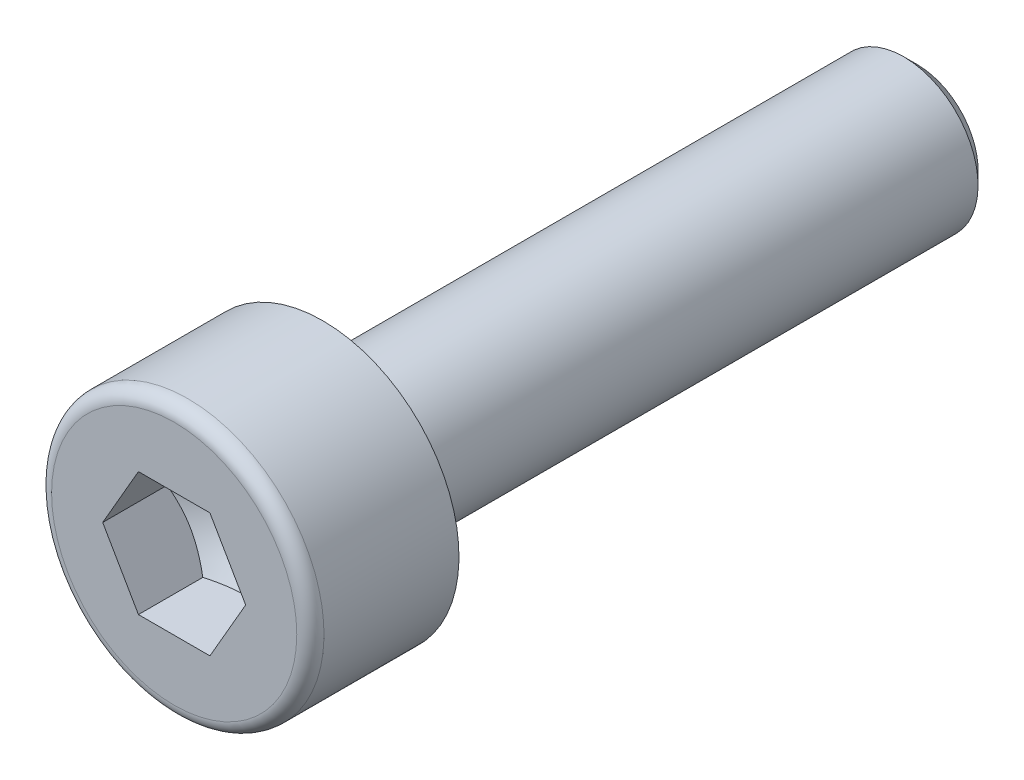
ISO-10303-21;
HEADER;
FILE_DESCRIPTION(('STEP AP214'),'2;1');
FILE_NAME('part.step','',(''),(''),'','','');
FILE_SCHEMA(('AUTOMOTIVE_DESIGN { 1 0 10303 214 1 1 1 1 }'));
ENDSEC;
DATA;
#1=APPLICATION_CONTEXT('core data for automotive mechanical design processes');
#2=APPLICATION_PROTOCOL_DEFINITION('international standard','automotive_design',2000,#1);
#3=PRODUCT_CONTEXT('',#1,'mechanical');
#4=PRODUCT('Part','Part','',(#3));
#5=PRODUCT_RELATED_PRODUCT_CATEGORY('part','',(#4));
#6=PRODUCT_DEFINITION_FORMATION('','',#4);
#7=PRODUCT_DEFINITION_CONTEXT('part definition',#1,'design');
#8=PRODUCT_DEFINITION('design','',#6,#7);
#9=PRODUCT_DEFINITION_SHAPE('','',#8);
#10=(LENGTH_UNIT() NAMED_UNIT(*) SI_UNIT(.MILLI.,.METRE.));
#11=(NAMED_UNIT(*) PLANE_ANGLE_UNIT() SI_UNIT($,.RADIAN.));
#12=(NAMED_UNIT(*) SI_UNIT($,.STERADIAN.) SOLID_ANGLE_UNIT());
#13=UNCERTAINTY_MEASURE_WITH_UNIT(LENGTH_MEASURE(1.E-05),#10,'distance_accuracy_value','');
#14=(GEOMETRIC_REPRESENTATION_CONTEXT(3) GLOBAL_UNCERTAINTY_ASSIGNED_CONTEXT((#13)) GLOBAL_UNIT_ASSIGNED_CONTEXT((#10,
#11,#12)) REPRESENTATION_CONTEXT('',''));
#15=CARTESIAN_POINT('',(0.,0.,0.));
#16=DIRECTION('',(0.,0.,1.));
#17=DIRECTION('',(1.,0.,0.));
#18=AXIS2_PLACEMENT_3D('',#15,#16,#17);
#19=CARTESIAN_POINT('',(0.,1.375,0.));
#20=DIRECTION('',(0.,0.,-1.));
#21=DIRECTION('',(0.,1.,0.));
#22=AXIS2_PLACEMENT_3D('',#19,#20,#21);
#23=PLANE('',#22);
#24=CARTESIAN_POINT('',(0.,0.,0.));
#25=DIRECTION('',(0.,0.,-1.));
#26=DIRECTION('',(0.,1.,0.));
#27=AXIS2_PLACEMENT_3D('',#24,#25,#26);
#28=CIRCLE('',#27,2.75);
#29=CARTESIAN_POINT('',(0.,2.75,0.));
#30=VERTEX_POINT('',#29);
#31=EDGE_CURVE('E11',#30,#30,#28,.T.);
#32=ORIENTED_EDGE('',*,*,#31,.T.);
#33=EDGE_LOOP('',(#32));
#34=FACE_BOUND('',#33,.T.);
#35=CARTESIAN_POINT('',(0.,0.,0.));
#36=DIRECTION('',(0.,0.,1.));
#37=DIRECTION('',(0.,1.,0.));
#38=AXIS2_PLACEMENT_3D('',#35,#36,#37);
#39=CIRCLE('',#38,1.5);
#40=CARTESIAN_POINT('',(0.,-1.5,0.));
#41=VERTEX_POINT('',#40);
#42=EDGE_CURVE('E164',#41,#41,#39,.T.);
#43=ORIENTED_EDGE('',*,*,#42,.T.);
#44=EDGE_LOOP('',(#43));
#45=FACE_BOUND('',#44,.T.);
#46=ADVANCED_FACE('F16',(#34,#45),#23,.T.);
#47=CARTESIAN_POINT('',(0.,0.,1.3625));
#48=DIRECTION('',(0.,0.,1.));
#49=DIRECTION('',(0.,1.,0.));
#50=AXIS2_PLACEMENT_3D('',#47,#48,#49);
#51=CYLINDRICAL_SURFACE('',#50,2.75);
#52=CARTESIAN_POINT('',(0.,0.,2.725));
#53=DIRECTION('',(0.,0.,-1.));
#54=DIRECTION('',(0.,1.,0.));
#55=AXIS2_PLACEMENT_3D('',#52,#53,#54);
#56=CIRCLE('',#55,2.75);
#57=CARTESIAN_POINT('',(0.,2.75,2.725));
#58=VERTEX_POINT('',#57);
#59=EDGE_CURVE('E25',#58,#58,#56,.T.);
#60=ORIENTED_EDGE('',*,*,#59,.T.);
#61=EDGE_LOOP('',(#60));
#62=FACE_BOUND('',#61,.T.);
#63=ORIENTED_EDGE('',*,*,#31,.F.);
#64=EDGE_LOOP('',(#63));
#65=FACE_BOUND('',#64,.T.);
#66=ADVANCED_FACE('F206',(#62,#65),#51,.T.);
#67=CARTESIAN_POINT('',(0.,0.,2.725));
#68=DIRECTION('',(0.,0.,-1.));
#69=DIRECTION('',(-1.,0.,0.));
#70=AXIS2_PLACEMENT_3D('',#67,#68,#69);
#71=TOROIDAL_SURFACE('',#70,2.475,0.275);
#72=CARTESIAN_POINT('',(0.,0.,3.));
#73=DIRECTION('',(0.,0.,-1.));
#74=DIRECTION('',(0.,1.,0.));
#75=AXIS2_PLACEMENT_3D('',#72,#73,#74);
#76=CIRCLE('',#75,2.475);
#77=CARTESIAN_POINT('',(0.,2.475,3.));
#78=VERTEX_POINT('',#77);
#79=EDGE_CURVE('E141',#78,#78,#76,.T.);
#80=ORIENTED_EDGE('',*,*,#79,.T.);
#81=EDGE_LOOP('',(#80));
#82=FACE_BOUND('',#81,.T.);
#83=ORIENTED_EDGE('',*,*,#59,.F.);
#84=EDGE_LOOP('',(#83));
#85=FACE_BOUND('',#84,.T.);
#86=ADVANCED_FACE('F18',(#82,#85),#71,.T.);
#87=CARTESIAN_POINT('',(0.,1.2375,3.));
#88=DIRECTION('',(0.,0.,1.));
#89=DIRECTION('',(0.,-1.,0.));
#90=AXIS2_PLACEMENT_3D('',#87,#88,#89);
#91=PLANE('',#90);
#92=ORIENTED_EDGE('',*,*,#79,.F.);
#93=EDGE_LOOP('',(#92));
#94=FACE_BOUND('',#93,.T.);
#95=DIRECTION('',(-0.5,0.866025403784439,0.));
#96=VECTOR('',#95,1.);
#97=CARTESIAN_POINT('',(-1.35045785929581,-0.160937208593682,3.));
#98=LINE('',#97,#96);
#99=CARTESIAN_POINT('',(-0.7216875,-1.24999941718736,3.));
#100=VERTEX_POINT('',#99);
#101=CARTESIAN_POINT('',(-1.443375,0.,3.));
#102=VERTEX_POINT('',#101);
#103=EDGE_CURVE('E124',#100,#102,#98,.T.);
#104=ORIENTED_EDGE('',*,*,#103,.T.);
#105=DIRECTION('',(0.5,0.866025403784439,0.));
#106=VECTOR('',#105,1.);
#107=CARTESIAN_POINT('',(-0.81460464070419,1.08906220859368,3.));
#108=LINE('',#107,#106);
#109=CARTESIAN_POINT('',(-0.7216875,1.24999941718736,3.));
#110=VERTEX_POINT('',#109);
#111=EDGE_CURVE('E160',#102,#110,#108,.T.);
#112=ORIENTED_EDGE('',*,*,#111,.T.);
#113=DIRECTION('',(1.,0.,0.));
#114=VECTOR('',#113,1.);
#115=CARTESIAN_POINT('',(0.,1.24999941718736,3.));
#116=LINE('',#115,#114);
#117=CARTESIAN_POINT('',(0.7216875,1.24999941718736,3.));
#118=VERTEX_POINT('',#117);
#119=EDGE_CURVE('E147',#110,#118,#116,.T.);
#120=ORIENTED_EDGE('',*,*,#119,.T.);
#121=DIRECTION('',(0.5,-0.866025403784439,0.));
#122=VECTOR('',#121,1.);
#123=CARTESIAN_POINT('',(0.814604640704189,1.08906220859368,3.));
#124=LINE('',#123,#122);
#125=CARTESIAN_POINT('',(1.443375,0.,3.));
#126=VERTEX_POINT('',#125);
#127=EDGE_CURVE('E157',#118,#126,#124,.T.);
#128=ORIENTED_EDGE('',*,*,#127,.T.);
#129=DIRECTION('',(-0.5,-0.866025403784439,0.));
#130=VECTOR('',#129,1.);
#131=CARTESIAN_POINT('',(1.35045785929581,-0.160937208593682,3.));
#132=LINE('',#131,#130);
#133=CARTESIAN_POINT('',(0.7216875,-1.24999941718736,3.));
#134=VERTEX_POINT('',#133);
#135=EDGE_CURVE('E102',#126,#134,#132,.T.);
#136=ORIENTED_EDGE('',*,*,#135,.T.);
#137=DIRECTION('',(-1.,0.,0.));
#138=VECTOR('',#137,1.);
#139=CARTESIAN_POINT('',(0.,-1.24999941718736,3.));
#140=LINE('',#139,#138);
#141=EDGE_CURVE('E101',#134,#100,#140,.T.);
#142=ORIENTED_EDGE('',*,*,#141,.T.);
#143=EDGE_LOOP('',(#104,#112,#120,#128,#136,#142));
#144=FACE_BOUND('',#143,.T.);
#145=ADVANCED_FACE('F178',(#94,#144),#91,.T.);
#146=CARTESIAN_POINT('',(0.,0.6146875,-12.));
#147=DIRECTION('',(0.,0.,-1.));
#148=DIRECTION('',(0.,1.,0.));
#149=AXIS2_PLACEMENT_3D('',#146,#147,#148);
#150=PLANE('',#149);
#151=CARTESIAN_POINT('',(0.,0.,-12.));
#152=DIRECTION('',(0.,0.,-1.));
#153=DIRECTION('',(0.,1.,0.));
#154=AXIS2_PLACEMENT_3D('',#151,#152,#153);
#155=CIRCLE('',#154,1.229375);
#156=CARTESIAN_POINT('',(0.,1.229375,-12.));
#157=VERTEX_POINT('',#156);
#158=EDGE_CURVE('E146',#157,#157,#155,.T.);
#159=ORIENTED_EDGE('',*,*,#158,.T.);
#160=EDGE_LOOP('',(#159));
#161=FACE_BOUND('',#160,.T.);
#162=ADVANCED_FACE('F215',(#161),#150,.T.);
#163=CARTESIAN_POINT('',(0.,0.,-11.8646875));
#164=DIRECTION('',(0.,0.,1.));
#165=DIRECTION('',(0.,1.,0.));
#166=AXIS2_PLACEMENT_3D('',#163,#164,#165);
#167=CONICAL_SURFACE('',#166,1.3646875,0.78539816339745);
#168=CARTESIAN_POINT('',(0.,0.,-11.729375));
#169=DIRECTION('',(0.,0.,-1.));
#170=DIRECTION('',(0.,1.,0.));
#171=AXIS2_PLACEMENT_3D('',#168,#169,#170);
#172=CIRCLE('',#171,1.5);
#173=CARTESIAN_POINT('',(0.,1.5,-11.729375));
#174=VERTEX_POINT('',#173);
#175=EDGE_CURVE('E162',#174,#174,#172,.T.);
#176=ORIENTED_EDGE('',*,*,#175,.T.);
#177=EDGE_LOOP('',(#176));
#178=FACE_BOUND('',#177,.T.);
#179=ORIENTED_EDGE('',*,*,#158,.F.);
#180=EDGE_LOOP('',(#179));
#181=FACE_BOUND('',#180,.T.);
#182=ADVANCED_FACE('F227',(#178,#181),#167,.T.);
#183=CARTESIAN_POINT('',(0.,0.,-5.3646875));
#184=DIRECTION('',(0.,0.,1.));
#185=DIRECTION('',(0.,1.,0.));
#186=AXIS2_PLACEMENT_3D('',#183,#184,#185);
#187=CYLINDRICAL_SURFACE('',#186,1.5);
#188=ORIENTED_EDGE('',*,*,#42,.F.);
#189=EDGE_LOOP('',(#188));
#190=FACE_BOUND('',#189,.T.);
#191=ORIENTED_EDGE('',*,*,#175,.F.);
#192=EDGE_LOOP('',(#191));
#193=FACE_BOUND('',#192,.T.);
#194=ADVANCED_FACE('F222',(#190,#193),#187,.T.);
#195=CARTESIAN_POINT('',(-1.08253125,0.624999708593682,3.));
#196=DIRECTION('',(-0.866025403784439,0.5,0.));
#197=DIRECTION('',(0.5,0.866025403784439,0.));
#198=AXIS2_PLACEMENT_3D('',#195,#196,#197);
#199=PLANE('',#198);
#200=CARTESIAN_POINT('',(-1.443375,0.,1.7));
#201=CARTESIAN_POINT('',(-1.08253125,0.62499970859368,1.49166676380211));
#202=CARTESIAN_POINT('',(-0.7216875,1.24999941718736,1.7));
#203=(BOUNDED_CURVE() B_SPLINE_CURVE(2,(#200,#201,#202),.UNSPECIFIED.,.F.,
.F.) B_SPLINE_CURVE_WITH_KNOTS((3,3),(0.,1.46054449161806),
.UNSPECIFIED.) CURVE() GEOMETRIC_REPRESENTATION_ITEM() RATIONAL_B_SPLINE_CURVE((1.,
1.15470053837926,1.)) REPRESENTATION_ITEM(''));
#204=CARTESIAN_POINT('',(-1.443375,0.,1.7));
#205=VERTEX_POINT('',#204);
#206=CARTESIAN_POINT('',(-0.7216875,1.24999941718736,1.7));
#207=VERTEX_POINT('',#206);
#208=EDGE_CURVE('E115',#205,#207,#203,.T.);
#209=ORIENTED_EDGE('',*,*,#208,.T.);
#210=DIRECTION('',(0.,0.,-1.));
#211=VECTOR('',#210,1.);
#212=CARTESIAN_POINT('',(-0.7216875,1.24999941718736,3.));
#213=LINE('',#212,#211);
#214=EDGE_CURVE('E148',#110,#207,#213,.T.);
#215=ORIENTED_EDGE('',*,*,#214,.F.);
#216=ORIENTED_EDGE('',*,*,#111,.F.);
#217=DIRECTION('',(0.,0.,-1.));
#218=VECTOR('',#217,1.);
#219=CARTESIAN_POINT('',(-1.443375,0.,3.));
#220=LINE('',#219,#218);
#221=EDGE_CURVE('E108',#102,#205,#220,.T.);
#222=ORIENTED_EDGE('',*,*,#221,.T.);
#223=EDGE_LOOP('',(#209,#215,#216,#222));
#224=FACE_BOUND('',#223,.T.);
#225=ADVANCED_FACE('F187',(#224),#199,.F.);
#226=CARTESIAN_POINT('',(0.,1.24999941718736,3.));
#227=DIRECTION('',(0.,1.,0.));
#228=DIRECTION('',(1.,0.,0.));
#229=AXIS2_PLACEMENT_3D('',#226,#227,#228);
#230=PLANE('',#229);
#231=CARTESIAN_POINT('',(-0.7216875,1.24999941718736,1.7));
#232=CARTESIAN_POINT('',(0.,1.24999941718737,1.4916667638021));
#233=CARTESIAN_POINT('',(0.7216875,1.24999941718736,1.7));
#234=(BOUNDED_CURVE() B_SPLINE_CURVE(2,(#231,#232,#233),.UNSPECIFIED.,.F.,
.F.) B_SPLINE_CURVE_WITH_KNOTS((3,3),(0.,1.46054449161806),
.UNSPECIFIED.) CURVE() GEOMETRIC_REPRESENTATION_ITEM() RATIONAL_B_SPLINE_CURVE((1.,
1.15470053837925,1.)) REPRESENTATION_ITEM(''));
#235=CARTESIAN_POINT('',(0.7216875,1.24999941718736,1.7));
#236=VERTEX_POINT('',#235);
#237=EDGE_CURVE('E136',#207,#236,#234,.T.);
#238=ORIENTED_EDGE('',*,*,#237,.T.);
#239=DIRECTION('',(0.,0.,-1.));
#240=VECTOR('',#239,1.);
#241=CARTESIAN_POINT('',(0.7216875,1.24999941718736,3.));
#242=LINE('',#241,#240);
#243=EDGE_CURVE('E77',#118,#236,#242,.T.);
#244=ORIENTED_EDGE('',*,*,#243,.F.);
#245=ORIENTED_EDGE('',*,*,#119,.F.);
#246=ORIENTED_EDGE('',*,*,#214,.T.);
#247=EDGE_LOOP('',(#238,#244,#245,#246));
#248=FACE_BOUND('',#247,.T.);
#249=ADVANCED_FACE('F184',(#248),#230,.F.);
#250=CARTESIAN_POINT('',(1.08253125,0.624999708593682,3.));
#251=DIRECTION('',(0.866025403784439,0.5,0.));
#252=DIRECTION('',(0.5,-0.866025403784439,0.));
#253=AXIS2_PLACEMENT_3D('',#250,#251,#252);
#254=PLANE('',#253);
#255=CARTESIAN_POINT('',(0.7216875,1.24999941718737,1.7));
#256=CARTESIAN_POINT('',(1.08253125,0.624999708593683,1.49166676380211));
#257=CARTESIAN_POINT('',(1.443375,0.,1.7));
#258=(BOUNDED_CURVE() B_SPLINE_CURVE(2,(#255,#256,#257),.UNSPECIFIED.,.F.,
.F.) B_SPLINE_CURVE_WITH_KNOTS((3,3),(0.,1.46054449161806),
.UNSPECIFIED.) CURVE() GEOMETRIC_REPRESENTATION_ITEM() RATIONAL_B_SPLINE_CURVE((1.,
1.15470053837925,1.)) REPRESENTATION_ITEM(''));
#259=CARTESIAN_POINT('',(1.443375,0.,1.7));
#260=VERTEX_POINT('',#259);
#261=EDGE_CURVE('E140',#236,#260,#258,.T.);
#262=ORIENTED_EDGE('',*,*,#261,.T.);
#263=DIRECTION('',(0.,0.,-1.));
#264=VECTOR('',#263,1.);
#265=CARTESIAN_POINT('',(1.443375,0.,3.));
#266=LINE('',#265,#264);
#267=EDGE_CURVE('E67',#126,#260,#266,.T.);
#268=ORIENTED_EDGE('',*,*,#267,.F.);
#269=ORIENTED_EDGE('',*,*,#127,.F.);
#270=ORIENTED_EDGE('',*,*,#243,.T.);
#271=EDGE_LOOP('',(#262,#268,#269,#270));
#272=FACE_BOUND('',#271,.T.);
#273=ADVANCED_FACE('F180',(#272),#254,.F.);
#274=CARTESIAN_POINT('',(1.08253125,-0.624999708593682,3.));
#275=DIRECTION('',(0.866025403784439,-0.5,0.));
#276=DIRECTION('',(-0.5,-0.866025403784439,0.));
#277=AXIS2_PLACEMENT_3D('',#274,#275,#276);
#278=PLANE('',#277);
#279=CARTESIAN_POINT('',(1.443375,0.,1.7));
#280=CARTESIAN_POINT('',(1.08253125,-0.624999708593683,1.49166676380211));
#281=CARTESIAN_POINT('',(0.7216875,-1.24999941718737,1.7));
#282=(BOUNDED_CURVE() B_SPLINE_CURVE(2,(#279,#280,#281),.UNSPECIFIED.,.F.,
.F.) B_SPLINE_CURVE_WITH_KNOTS((3,3),(0.,1.46054449161806),
.UNSPECIFIED.) CURVE() GEOMETRIC_REPRESENTATION_ITEM() RATIONAL_B_SPLINE_CURVE((1.,
1.15470053837925,1.)) REPRESENTATION_ITEM(''));
#283=CARTESIAN_POINT('',(0.7216875,-1.24999941718736,1.7));
#284=VERTEX_POINT('',#283);
#285=EDGE_CURVE('E104',#260,#284,#282,.T.);
#286=ORIENTED_EDGE('',*,*,#285,.T.);
#287=DIRECTION('',(0.,0.,-1.));
#288=VECTOR('',#287,1.);
#289=CARTESIAN_POINT('',(0.7216875,-1.24999941718736,3.));
#290=LINE('',#289,#288);
#291=EDGE_CURVE('E95',#134,#284,#290,.T.);
#292=ORIENTED_EDGE('',*,*,#291,.F.);
#293=ORIENTED_EDGE('',*,*,#135,.F.);
#294=ORIENTED_EDGE('',*,*,#267,.T.);
#295=EDGE_LOOP('',(#286,#292,#293,#294));
#296=FACE_BOUND('',#295,.T.);
#297=ADVANCED_FACE('F105',(#296),#278,.F.);
#298=CARTESIAN_POINT('',(0.,-1.24999941718736,3.));
#299=DIRECTION('',(0.,-1.,0.));
#300=DIRECTION('',(-1.,0.,0.));
#301=AXIS2_PLACEMENT_3D('',#298,#299,#300);
#302=PLANE('',#301);
#303=CARTESIAN_POINT('',(0.7216875,-1.24999941718736,1.7));
#304=CARTESIAN_POINT('',(0.,-1.24999941718736,1.4916667638021));
#305=CARTESIAN_POINT('',(-0.7216875,-1.24999941718736,1.7));
#306=(BOUNDED_CURVE() B_SPLINE_CURVE(2,(#303,#304,#305),.UNSPECIFIED.,.F.,
.F.) B_SPLINE_CURVE_WITH_KNOTS((3,3),(0.,1.46054449161806),
.UNSPECIFIED.) CURVE() GEOMETRIC_REPRESENTATION_ITEM() RATIONAL_B_SPLINE_CURVE((1.,
1.15470053837925,1.)) REPRESENTATION_ITEM(''));
#307=CARTESIAN_POINT('',(-0.7216875,-1.24999941718736,1.7));
#308=VERTEX_POINT('',#307);
#309=EDGE_CURVE('E99',#284,#308,#306,.T.);
#310=ORIENTED_EDGE('',*,*,#309,.T.);
#311=DIRECTION('',(0.,0.,-1.));
#312=VECTOR('',#311,1.);
#313=CARTESIAN_POINT('',(-0.7216875,-1.24999941718736,3.));
#314=LINE('',#313,#312);
#315=EDGE_CURVE('E120',#100,#308,#314,.T.);
#316=ORIENTED_EDGE('',*,*,#315,.F.);
#317=ORIENTED_EDGE('',*,*,#141,.F.);
#318=ORIENTED_EDGE('',*,*,#291,.T.);
#319=EDGE_LOOP('',(#310,#316,#317,#318));
#320=FACE_BOUND('',#319,.T.);
#321=ADVANCED_FACE('F96',(#320),#302,.F.);
#322=CARTESIAN_POINT('',(-1.08253125,-0.624999708593682,3.));
#323=DIRECTION('',(-0.866025403784439,-0.5,0.));
#324=DIRECTION('',(-0.5,0.866025403784439,0.));
#325=AXIS2_PLACEMENT_3D('',#322,#323,#324);
#326=PLANE('',#325);
#327=CARTESIAN_POINT('',(-0.7216875,-1.24999941718737,1.7));
#328=CARTESIAN_POINT('',(-1.08253125,-0.624999708593682,1.4916667638021));
#329=CARTESIAN_POINT('',(-1.443375,0.,1.7));
#330=(BOUNDED_CURVE() B_SPLINE_CURVE(2,(#327,#328,#329),.UNSPECIFIED.,.F.,
.F.) B_SPLINE_CURVE_WITH_KNOTS((3,3),(0.,1.46054449161806),
.UNSPECIFIED.) CURVE() GEOMETRIC_REPRESENTATION_ITEM() RATIONAL_B_SPLINE_CURVE((1.,
1.15470053837925,1.)) REPRESENTATION_ITEM(''));
#331=EDGE_CURVE('E113',#308,#205,#330,.T.);
#332=ORIENTED_EDGE('',*,*,#331,.T.);
#333=ORIENTED_EDGE('',*,*,#221,.F.);
#334=ORIENTED_EDGE('',*,*,#103,.F.);
#335=ORIENTED_EDGE('',*,*,#315,.T.);
#336=EDGE_LOOP('',(#332,#333,#334,#335));
#337=FACE_BOUND('',#336,.T.);
#338=ADVANCED_FACE('F193',(#337),#326,.F.);
#339=CARTESIAN_POINT('',(0.,0.,1.28333352760421));
#340=DIRECTION('',(0.,0.,1.));
#341=DIRECTION('',(0.,1.,0.));
#342=AXIS2_PLACEMENT_3D('',#339,#340,#341);
#343=CONICAL_SURFACE('',#342,0.7216875,1.0471975511966);
#344=CARTESIAN_POINT('',(0.,0.,0.866667055208424));
#345=VERTEX_POINT('',#344);
#346=VERTEX_LOOP('',#345);
#347=FACE_BOUND('',#346,.T.);
#348=ORIENTED_EDGE('',*,*,#261,.F.);
#349=ORIENTED_EDGE('',*,*,#237,.F.);
#350=ORIENTED_EDGE('',*,*,#208,.F.);
#351=ORIENTED_EDGE('',*,*,#331,.F.);
#352=ORIENTED_EDGE('',*,*,#309,.F.);
#353=ORIENTED_EDGE('',*,*,#285,.F.);
#354=EDGE_LOOP('',(#348,#349,#350,#351,#352,#353));
#355=FACE_BOUND('',#354,.T.);
#356=ADVANCED_FACE('F110',(#347,#355),#343,.F.);
#357=CLOSED_SHELL('',(#46,#66,#86,#145,#162,#182,#194,#225,#249,#273,#297,#321,#338,#356));
#358=MANIFOLD_SOLID_BREP('B1',#357);
#359=ADVANCED_BREP_SHAPE_REPRESENTATION('',(#18,#358),#14);
#360=SHAPE_DEFINITION_REPRESENTATION(#9,#359);
ENDSEC;
END-ISO-10303-21;
